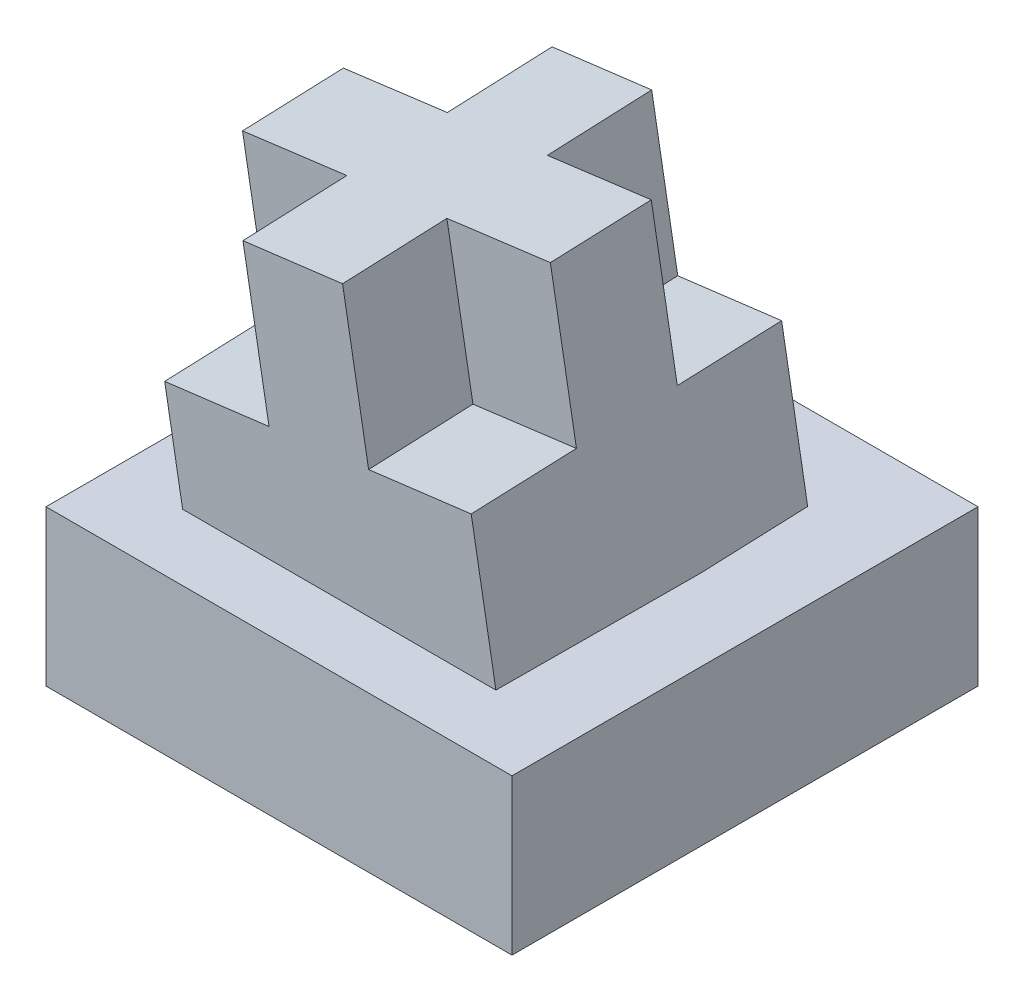
ISO-10303-21;
HEADER;
FILE_DESCRIPTION(('STEP AP214'),'2;1');
FILE_NAME('part.step','',(''),(''),'','','');
FILE_SCHEMA(('AUTOMOTIVE_DESIGN { 1 0 10303 214 1 1 1 1 }'));
ENDSEC;
DATA;
#1=APPLICATION_CONTEXT('core data for automotive mechanical design processes');
#2=APPLICATION_PROTOCOL_DEFINITION('international standard','automotive_design',2000,#1);
#3=PRODUCT_CONTEXT('',#1,'mechanical');
#4=PRODUCT('Part','Part','',(#3));
#5=PRODUCT_RELATED_PRODUCT_CATEGORY('part','',(#4));
#6=PRODUCT_DEFINITION_FORMATION('','',#4);
#7=PRODUCT_DEFINITION_CONTEXT('part definition',#1,'design');
#8=PRODUCT_DEFINITION('design','',#6,#7);
#9=PRODUCT_DEFINITION_SHAPE('','',#8);
#10=(LENGTH_UNIT() NAMED_UNIT(*) SI_UNIT(.MILLI.,.METRE.));
#11=(NAMED_UNIT(*) PLANE_ANGLE_UNIT() SI_UNIT($,.RADIAN.));
#12=(NAMED_UNIT(*) SI_UNIT($,.STERADIAN.) SOLID_ANGLE_UNIT());
#13=UNCERTAINTY_MEASURE_WITH_UNIT(LENGTH_MEASURE(1.E-05),#10,'distance_accuracy_value','');
#14=(GEOMETRIC_REPRESENTATION_CONTEXT(3) GLOBAL_UNCERTAINTY_ASSIGNED_CONTEXT((#13)) GLOBAL_UNIT_ASSIGNED_CONTEXT((#10,
#11,#12)) REPRESENTATION_CONTEXT('',''));
#15=CARTESIAN_POINT('',(0.,0.,0.));
#16=DIRECTION('',(0.,0.,1.));
#17=DIRECTION('',(1.,0.,0.));
#18=AXIS2_PLACEMENT_3D('',#15,#16,#17);
#19=CARTESIAN_POINT('',(15.,10.,15.));
#20=DIRECTION('',(-1.,0.,0.));
#21=DIRECTION('',(0.,0.,1.));
#22=AXIS2_PLACEMENT_3D('',#19,#20,#21);
#23=PLANE('',#22);
#24=DIRECTION('',(0.,0.,-1.));
#25=VECTOR('',#24,1.);
#26=CARTESIAN_POINT('',(15.,0.,15.));
#27=LINE('',#26,#25);
#28=CARTESIAN_POINT('',(15.,0.,15.));
#29=VERTEX_POINT('',#28);
#30=CARTESIAN_POINT('',(15.,0.,-15.));
#31=VERTEX_POINT('',#30);
#32=EDGE_CURVE('E247',#29,#31,#27,.T.);
#33=ORIENTED_EDGE('',*,*,#32,.T.);
#34=DIRECTION('',(0.,-1.,0.));
#35=VECTOR('',#34,1.);
#36=CARTESIAN_POINT('',(15.,10.,-15.));
#37=LINE('',#36,#35);
#38=CARTESIAN_POINT('',(15.,10.,-15.));
#39=VERTEX_POINT('',#38);
#40=EDGE_CURVE('E293',#39,#31,#37,.T.);
#41=ORIENTED_EDGE('',*,*,#40,.F.);
#42=DIRECTION('',(0.,0.,-1.));
#43=VECTOR('',#42,1.);
#44=CARTESIAN_POINT('',(15.,10.,15.));
#45=LINE('',#44,#43);
#46=CARTESIAN_POINT('',(15.,10.,15.));
#47=VERTEX_POINT('',#46);
#48=EDGE_CURVE('E256',#47,#39,#45,.T.);
#49=ORIENTED_EDGE('',*,*,#48,.F.);
#50=DIRECTION('',(0.,-1.,0.));
#51=VECTOR('',#50,1.);
#52=CARTESIAN_POINT('',(15.,10.,15.));
#53=LINE('',#52,#51);
#54=EDGE_CURVE('E270',#47,#29,#53,.T.);
#55=ORIENTED_EDGE('',*,*,#54,.T.);
#56=EDGE_LOOP('',(#33,#41,#49,#55));
#57=FACE_BOUND('',#56,.T.);
#58=ADVANCED_FACE('F43',(#57),#23,.F.);
#59=CARTESIAN_POINT('',(-15.,10.,-15.));
#60=DIRECTION('',(0.,0.,1.));
#61=DIRECTION('',(1.,0.,0.));
#62=AXIS2_PLACEMENT_3D('',#59,#60,#61);
#63=PLANE('',#62);
#64=DIRECTION('',(-1.,0.,0.));
#65=VECTOR('',#64,1.);
#66=CARTESIAN_POINT('',(-15.,0.,-15.));
#67=LINE('',#66,#65);
#68=CARTESIAN_POINT('',(-15.,0.,-15.));
#69=VERTEX_POINT('',#68);
#70=EDGE_CURVE('E274',#31,#69,#67,.T.);
#71=ORIENTED_EDGE('',*,*,#70,.T.);
#72=DIRECTION('',(0.,-1.,0.));
#73=VECTOR('',#72,1.);
#74=CARTESIAN_POINT('',(-15.,10.,-15.));
#75=LINE('',#74,#73);
#76=CARTESIAN_POINT('',(-15.,10.,-15.));
#77=VERTEX_POINT('',#76);
#78=EDGE_CURVE('E289',#77,#69,#75,.T.);
#79=ORIENTED_EDGE('',*,*,#78,.F.);
#80=DIRECTION('',(-1.,0.,0.));
#81=VECTOR('',#80,1.);
#82=CARTESIAN_POINT('',(-15.,10.,-15.));
#83=LINE('',#82,#81);
#84=EDGE_CURVE('E260',#39,#77,#83,.T.);
#85=ORIENTED_EDGE('',*,*,#84,.F.);
#86=ORIENTED_EDGE('',*,*,#40,.T.);
#87=EDGE_LOOP('',(#71,#79,#85,#86));
#88=FACE_BOUND('',#87,.T.);
#89=ADVANCED_FACE('F479',(#88),#63,.F.);
#90=CARTESIAN_POINT('',(-15.,10.,15.));
#91=DIRECTION('',(1.,0.,0.));
#92=DIRECTION('',(0.,0.,-1.));
#93=AXIS2_PLACEMENT_3D('',#90,#91,#92);
#94=PLANE('',#93);
#95=DIRECTION('',(0.,0.,1.));
#96=VECTOR('',#95,1.);
#97=CARTESIAN_POINT('',(-15.,0.,15.));
#98=LINE('',#97,#96);
#99=CARTESIAN_POINT('',(-15.,0.,15.));
#100=VERTEX_POINT('',#99);
#101=EDGE_CURVE('E277',#69,#100,#98,.T.);
#102=ORIENTED_EDGE('',*,*,#101,.T.);
#103=DIRECTION('',(0.,-1.,0.));
#104=VECTOR('',#103,1.);
#105=CARTESIAN_POINT('',(-15.,10.,15.));
#106=LINE('',#105,#104);
#107=CARTESIAN_POINT('',(-15.,10.,15.));
#108=VERTEX_POINT('',#107);
#109=EDGE_CURVE('E285',#108,#100,#106,.T.);
#110=ORIENTED_EDGE('',*,*,#109,.F.);
#111=DIRECTION('',(0.,0.,1.));
#112=VECTOR('',#111,1.);
#113=CARTESIAN_POINT('',(-15.,10.,15.));
#114=LINE('',#113,#112);
#115=EDGE_CURVE('E264',#77,#108,#114,.T.);
#116=ORIENTED_EDGE('',*,*,#115,.F.);
#117=ORIENTED_EDGE('',*,*,#78,.T.);
#118=EDGE_LOOP('',(#102,#110,#116,#117));
#119=FACE_BOUND('',#118,.T.);
#120=ADVANCED_FACE('F484',(#119),#94,.F.);
#121=CARTESIAN_POINT('',(-15.,10.,15.));
#122=DIRECTION('',(0.,0.,-1.));
#123=DIRECTION('',(-1.,0.,0.));
#124=AXIS2_PLACEMENT_3D('',#121,#122,#123);
#125=PLANE('',#124);
#126=DIRECTION('',(1.,0.,0.));
#127=VECTOR('',#126,1.);
#128=CARTESIAN_POINT('',(-15.,0.,15.));
#129=LINE('',#128,#127);
#130=EDGE_CURVE('E261',#100,#29,#129,.T.);
#131=ORIENTED_EDGE('',*,*,#130,.T.);
#132=ORIENTED_EDGE('',*,*,#54,.F.);
#133=DIRECTION('',(1.,0.,0.));
#134=VECTOR('',#133,1.);
#135=CARTESIAN_POINT('',(-15.,10.,15.));
#136=LINE('',#135,#134);
#137=EDGE_CURVE('E267',#108,#47,#136,.T.);
#138=ORIENTED_EDGE('',*,*,#137,.F.);
#139=ORIENTED_EDGE('',*,*,#109,.T.);
#140=EDGE_LOOP('',(#131,#132,#138,#139));
#141=FACE_BOUND('',#140,.T.);
#142=ADVANCED_FACE('F499',(#141),#125,.F.);
#143=CARTESIAN_POINT('',(0.,10.,0.));
#144=DIRECTION('',(0.,-1.,0.));
#145=DIRECTION('',(0.,0.,-1.));
#146=AXIS2_PLACEMENT_3D('',#143,#144,#145);
#147=PLANE('',#146);
#148=DIRECTION('',(-1.,0.,0.));
#149=VECTOR('',#148,1.);
#150=CARTESIAN_POINT('',(0.,10.,10.7411292726449));
#151=LINE('',#150,#149);
#152=CARTESIAN_POINT('',(9.70486879806121,10.,10.7411292726449));
#153=VERTEX_POINT('',#152);
#154=CARTESIAN_POINT('',(-10.463482466703,10.,10.7411292726449));
#155=VERTEX_POINT('',#154);
#156=EDGE_CURVE('E51',#153,#155,#151,.T.);
#157=ORIENTED_EDGE('',*,*,#156,.T.);
#158=DIRECTION('',(0.00508193772155888,0.,-0.999987086871123));
#159=VECTOR('',#158,1.);
#160=CARTESIAN_POINT('',(-10.4086271907026,10.,-0.052896678211698));
#161=LINE('',#160,#159);
#162=CARTESIAN_POINT('',(-10.3617646744846,10.,-9.27416495104109));
#163=VERTEX_POINT('',#162);
#164=EDGE_CURVE('E11',#155,#163,#161,.T.);
#165=ORIENTED_EDGE('',*,*,#164,.T.);
#166=DIRECTION('',(1.,0.,0.));
#167=VECTOR('',#166,1.);
#168=CARTESIAN_POINT('',(0.,10.,-9.27416495104109));
#169=LINE('',#168,#167);
#170=CARTESIAN_POINT('',(7.70309239535227,10.,-9.27416495104109));
#171=VERTEX_POINT('',#170);
#172=EDGE_CURVE('E301',#163,#171,#169,.T.);
#173=ORIENTED_EDGE('',*,*,#172,.T.);
#174=DIRECTION('',(0.287878386169738,0.,0.957666974880259));
#175=VECTOR('',#174,1.);
#176=CARTESIAN_POINT('',(9.62151617339583,10.,-2.89226486989336));
#177=LINE('',#176,#175);
#178=CARTESIAN_POINT('',(9.77161616497961,10.,-2.39293664042066));
#179=VERTEX_POINT('',#178);
#180=EDGE_CURVE('E297',#171,#179,#177,.T.);
#181=ORIENTED_EDGE('',*,*,#180,.T.);
#182=DIRECTION('',(-0.00508193772155887,0.,0.999987086871123));
#183=VECTOR('',#182,1.);
#184=CARTESIAN_POINT('',(9.7592032043864,10.,0.0495963033401863));
#185=LINE('',#184,#183);
#186=EDGE_CURVE('E305',#179,#153,#185,.T.);
#187=ORIENTED_EDGE('',*,*,#186,.T.);
#188=EDGE_LOOP('',(#157,#165,#173,#181,#187));
#189=FACE_BOUND('',#188,.T.);
#190=ORIENTED_EDGE('',*,*,#48,.T.);
#191=ORIENTED_EDGE('',*,*,#84,.T.);
#192=ORIENTED_EDGE('',*,*,#115,.T.);
#193=ORIENTED_EDGE('',*,*,#137,.T.);
#194=EDGE_LOOP('',(#190,#191,#192,#193));
#195=FACE_BOUND('',#194,.T.);
#196=ADVANCED_FACE('F312',(#189,#195),#147,.F.);
#197=CARTESIAN_POINT('',(0.,0.,0.));
#198=DIRECTION('',(0.,-1.,0.));
#199=DIRECTION('',(0.,0.,-1.));
#200=AXIS2_PLACEMENT_3D('',#197,#198,#199);
#201=PLANE('',#200);
#202=ORIENTED_EDGE('',*,*,#32,.F.);
#203=ORIENTED_EDGE('',*,*,#130,.F.);
#204=ORIENTED_EDGE('',*,*,#101,.F.);
#205=ORIENTED_EDGE('',*,*,#70,.F.);
#206=EDGE_LOOP('',(#202,#203,#204,#205));
#207=FACE_BOUND('',#206,.T.);
#208=ADVANCED_FACE('F492',(#207),#201,.T.);
#209=CARTESIAN_POINT('',(7.19286288242222,29.3049408690089,11.4962479391661));
#210=DIRECTION('',(0.991652700681669,0.128839139396997,0.00503958234305619));
#211=DIRECTION('',(-0.128840775517109,0.991665293616828,0.));
#212=AXIS2_PLACEMENT_3D('',#209,#210,#211);
#213=PLANE('',#212);
#214=DIRECTION('',(-0.128937664127869,0.990894952229234,0.0387591591223742));
#215=VECTOR('',#214,1.);
#216=CARTESIAN_POINT('',(8.48223952370092,19.6609485103213,4.33490991180389));
#217=LINE('',#216,#215);
#218=CARTESIAN_POINT('',(8.48223952370092,19.6609485103213,4.33490991180389));
#219=VERTEX_POINT('',#218);
#220=CARTESIAN_POINT('',(7.19286288242222,29.5698980326136,4.72250150302721));
#221=VERTEX_POINT('',#220);
#222=EDGE_CURVE('E344',#219,#221,#217,.T.);
#223=ORIENTED_EDGE('',*,*,#222,.F.);
#224=DIRECTION('',(0.,0.0390854167953465,-0.999235873152047));
#225=VECTOR('',#224,1.);
#226=CARTESIAN_POINT('',(8.48223952370092,19.6609485103213,4.33490991180389));
#227=LINE('',#226,#225);
#228=CARTESIAN_POINT('',(8.48223952370092,19.3959913467166,11.1086563479424));
#229=VERTEX_POINT('',#228);
#230=EDGE_CURVE('E343',#229,#219,#227,.T.);
#231=ORIENTED_EDGE('',*,*,#230,.F.);
#232=DIRECTION('',(0.128937664127869,-0.990894952229234,-0.0387591591223743));
#233=VECTOR('',#232,1.);
#234=CARTESIAN_POINT('',(7.19286288242222,29.3049408690089,11.4962479391661));
#235=LINE('',#234,#233);
#236=EDGE_CURVE('E240',#229,#153,#235,.T.);
#237=ORIENTED_EDGE('',*,*,#236,.T.);
#238=ORIENTED_EDGE('',*,*,#186,.F.);
#239=DIRECTION('',(0.,-0.0390854167953467,0.999235873152047));
#240=VECTOR('',#239,1.);
#241=CARTESIAN_POINT('',(9.77161616497961,9.48704182442421,10.7210647567186));
#242=LINE('',#241,#240);
#243=CARTESIAN_POINT('',(9.77161616497961,10.2687501603311,-9.26365270632231));
#244=VERTEX_POINT('',#243);
#245=EDGE_CURVE('E228',#244,#179,#242,.T.);
#246=ORIENTED_EDGE('',*,*,#245,.F.);
#247=DIRECTION('',(0.128937664127869,-0.990894952229234,-0.0387591591223743));
#248=VECTOR('',#247,1.);
#249=CARTESIAN_POINT('',(7.19286288242222,30.0866492049158,-8.48846952387482));
#250=LINE('',#249,#248);
#251=CARTESIAN_POINT('',(8.48223952370092,20.1776996826235,-8.87606111509856));
#252=VERTEX_POINT('',#251);
#253=EDGE_CURVE('E244',#252,#244,#250,.T.);
#254=ORIENTED_EDGE('',*,*,#253,.F.);
#255=DIRECTION('',(0.,0.0390854167953467,-0.999235873152047));
#256=VECTOR('',#255,1.);
#257=CARTESIAN_POINT('',(8.48223952370092,20.1776996826235,-8.87606111509856));
#258=LINE('',#257,#256);
#259=CARTESIAN_POINT('',(8.48223952370092,19.9150037194911,-2.16012326368442));
#260=VERTEX_POINT('',#259);
#261=EDGE_CURVE('E209',#260,#252,#258,.T.);
#262=ORIENTED_EDGE('',*,*,#261,.F.);
#263=DIRECTION('',(-0.128937664127869,0.990894952229234,0.0387591591223742));
#264=VECTOR('',#263,1.);
#265=CARTESIAN_POINT('',(8.48223952370092,19.9150037194911,-2.16012326368442));
#266=LINE('',#265,#264);
#267=CARTESIAN_POINT('',(7.19286288242222,29.8239532417834,-1.77253167246067));
#268=VERTEX_POINT('',#267);
#269=EDGE_CURVE('E191',#260,#268,#266,.T.);
#270=ORIENTED_EDGE('',*,*,#269,.T.);
#271=DIRECTION('',(0.,-0.0390854167953467,0.999235873152047));
#272=VECTOR('',#271,1.);
#273=CARTESIAN_POINT('',(7.19286288242222,29.3049408690089,11.4962479391661));
#274=LINE('',#273,#272);
#275=EDGE_CURVE('E207',#268,#221,#274,.T.);
#276=ORIENTED_EDGE('',*,*,#275,.T.);
#277=EDGE_LOOP('',(#223,#231,#237,#238,#246,#254,#262,#270,#276));
#278=FACE_BOUND('',#277,.T.);
#279=ADVANCED_FACE('F206',(#278),#213,.T.);
#280=CARTESIAN_POINT('',(-12.6401911312112,27.5098664169759,-8.58926117073594));
#281=DIRECTION('',(0.,0.0390854167953467,-0.999235873152047));
#282=DIRECTION('',(0.,0.999235873152047,0.0390854167953467));
#283=AXIS2_PLACEMENT_3D('',#280,#281,#282);
#284=PLANE('',#283);
#285=DIRECTION('',(-0.128937664127869,0.990894952229234,0.0387591591223742));
#286=VECTOR('',#285,1.);
#287=CARTESIAN_POINT('',(-4.68599240383939,18.4668349133771,-8.94298211381685));
#288=LINE('',#287,#286);
#289=CARTESIAN_POINT('',(-4.68599240383939,18.4668349133771,-8.94298211381685));
#290=VERTEX_POINT('',#289);
#291=CARTESIAN_POINT('',(-5.97536904511808,28.3757844356694,-8.55539052259311));
#292=VERTEX_POINT('',#291);
#293=EDGE_CURVE('E365',#290,#292,#288,.T.);
#294=ORIENTED_EDGE('',*,*,#293,.T.);
#295=DIRECTION('',(0.99165270068167,0.128839139396997,0.00503958234305615));
#296=VECTOR('',#295,1.);
#297=CARTESIAN_POINT('',(-12.6401911312112,27.5098664169759,-8.58926117073594));
#298=LINE('',#297,#296);
#299=CARTESIAN_POINT('',(0.470432940707133,29.2132465632936,-8.52263293533269));
#300=VERTEX_POINT('',#299);
#301=EDGE_CURVE('E236',#292,#300,#298,.T.);
#302=ORIENTED_EDGE('',*,*,#301,.T.);
#303=DIRECTION('',(-0.128937664127869,0.990894952229234,0.0387591591223742));
#304=VECTOR('',#303,1.);
#305=CARTESIAN_POINT('',(1.75980958198582,19.3042970410013,-8.91022452655644));
#306=LINE('',#305,#304);
#307=CARTESIAN_POINT('',(1.75980958198582,19.3042970410013,-8.91022452655644));
#308=VERTEX_POINT('',#307);
#309=EDGE_CURVE('E441',#308,#300,#306,.T.);
#310=ORIENTED_EDGE('',*,*,#309,.F.);
#311=DIRECTION('',(-0.991652700681669,-0.128839139396997,-0.00503958234305611));
#312=VECTOR('',#311,1.);
#313=CARTESIAN_POINT('',(1.75980958198582,19.3042970410013,-8.91022452655644));
#314=LINE('',#313,#312);
#315=EDGE_CURVE('E200',#252,#308,#314,.T.);
#316=ORIENTED_EDGE('',*,*,#315,.F.);
#317=ORIENTED_EDGE('',*,*,#253,.T.);
#318=DIRECTION('',(0.99165270068167,0.128839139396997,0.00503958234305615));
#319=VECTOR('',#318,1.);
#320=CARTESIAN_POINT('',(-10.0614378486538,7.69196737239121,-9.36444435318343));
#321=LINE('',#320,#319);
#322=EDGE_CURVE('E220',#171,#244,#321,.T.);
#323=ORIENTED_EDGE('',*,*,#322,.F.);
#324=ORIENTED_EDGE('',*,*,#172,.F.);
#325=DIRECTION('',(0.128937664127869,-0.990894952229234,-0.0387591591223743));
#326=VECTOR('',#325,1.);
#327=CARTESIAN_POINT('',(-12.6401911312112,27.5098664169759,-8.58926117073594));
#328=LINE('',#327,#326);
#329=CARTESIAN_POINT('',(-11.3508144899325,17.6009168946836,-8.97685276195969));
#330=VERTEX_POINT('',#329);
#331=EDGE_CURVE('E248',#330,#163,#328,.T.);
#332=ORIENTED_EDGE('',*,*,#331,.F.);
#333=DIRECTION('',(-0.99165270068167,-0.128839139396997,-0.00503958234305645));
#334=VECTOR('',#333,1.);
#335=CARTESIAN_POINT('',(-11.3508144899325,17.6009168946836,-8.97685276195969));
#336=LINE('',#335,#334);
#337=EDGE_CURVE('E361',#290,#330,#336,.T.);
#338=ORIENTED_EDGE('',*,*,#337,.F.);
#339=EDGE_LOOP('',(#294,#302,#310,#316,#317,#323,#324,#332,#338));
#340=FACE_BOUND('',#339,.T.);
#341=ADVANCED_FACE('F337',(#340),#284,.T.);
#342=CARTESIAN_POINT('',(-12.6401911312112,26.728158081069,11.395456292305));
#343=DIRECTION('',(-0.991652700681669,-0.128839139396997,-0.0050395823430562));
#344=DIRECTION('',(0.128840775517109,-0.991665293616828,0.));
#345=AXIS2_PLACEMENT_3D('',#342,#343,#344);
#346=PLANE('',#345);
#347=DIRECTION('',(-0.128937664127869,0.990894952229234,0.0387591591223742));
#348=VECTOR('',#347,1.);
#349=CARTESIAN_POINT('',(-11.3508144899325,17.3348640793193,-2.17509550663703));
#350=LINE('',#349,#348);
#351=CARTESIAN_POINT('',(-11.3508144899325,17.3348640793193,-2.17509550663703));
#352=VERTEX_POINT('',#351);
#353=CARTESIAN_POINT('',(-12.6401911312112,27.2438136016116,-1.78750391541329));
#354=VERTEX_POINT('',#353);
#355=EDGE_CURVE('E66',#352,#354,#350,.T.);
#356=ORIENTED_EDGE('',*,*,#355,.F.);
#357=DIRECTION('',(0.,-0.0390854167953464,0.999235873152047));
#358=VECTOR('',#357,1.);
#359=CARTESIAN_POINT('',(-11.3508144899325,17.3348640793193,-2.17509550663703));
#360=LINE('',#359,#358);
#361=EDGE_CURVE('E332',#330,#352,#360,.T.);
#362=ORIENTED_EDGE('',*,*,#361,.F.);
#363=ORIENTED_EDGE('',*,*,#331,.T.);
#364=ORIENTED_EDGE('',*,*,#164,.F.);
#365=DIRECTION('',(0.128937664127869,-0.990894952229234,-0.0387591591223743));
#366=VECTOR('',#365,1.);
#367=CARTESIAN_POINT('',(-12.6401911312112,26.728158081069,11.395456292305));
#368=LINE('',#367,#366);
#369=CARTESIAN_POINT('',(-11.3508144899325,16.8192085587766,11.0078647010813));
#370=VERTEX_POINT('',#369);
#371=EDGE_CURVE('E251',#370,#155,#368,.T.);
#372=ORIENTED_EDGE('',*,*,#371,.F.);
#373=DIRECTION('',(0.,-0.0390854167953467,0.999235873152047));
#374=VECTOR('',#373,1.);
#375=CARTESIAN_POINT('',(-11.3508144899325,17.0808065276956,4.31999755471776));
#376=LINE('',#375,#374);
#377=CARTESIAN_POINT('',(-11.3508144899325,17.0808065276956,4.31999755471776));
#378=VERTEX_POINT('',#377);
#379=EDGE_CURVE('E398',#378,#370,#376,.T.);
#380=ORIENTED_EDGE('',*,*,#379,.F.);
#381=DIRECTION('',(-0.128937664127869,0.990894952229234,0.0387591591223742));
#382=VECTOR('',#381,1.);
#383=CARTESIAN_POINT('',(-11.3508144899325,17.0808065276956,4.31999755471776));
#384=LINE('',#383,#382);
#385=CARTESIAN_POINT('',(-12.6401911312112,26.9897560499879,4.70758914594151));
#386=VERTEX_POINT('',#385);
#387=EDGE_CURVE('E242',#378,#386,#384,.T.);
#388=ORIENTED_EDGE('',*,*,#387,.T.);
#389=DIRECTION('',(0.,0.0390854167953467,-0.999235873152047));
#390=VECTOR('',#389,1.);
#391=CARTESIAN_POINT('',(-12.6401911312112,26.728158081069,11.395456292305));
#392=LINE('',#391,#390);
#393=EDGE_CURVE('E225',#386,#354,#392,.T.);
#394=ORIENTED_EDGE('',*,*,#393,.T.);
#395=EDGE_LOOP('',(#356,#362,#363,#364,#372,#380,#388,#394));
#396=FACE_BOUND('',#395,.T.);
#397=ADVANCED_FACE('F327',(#396),#346,.T.);
#398=CARTESIAN_POINT('',(-12.6401911312112,26.728158081069,11.395456292305));
#399=DIRECTION('',(0.,-0.0390854167953467,0.999235873152047));
#400=DIRECTION('',(0.,-0.999235873152047,-0.0390854167953467));
#401=AXIS2_PLACEMENT_3D('',#398,#399,#400);
#402=PLANE('',#401);
#403=DIRECTION('',(-0.128937664127869,0.990894952229234,0.0387591591223742));
#404=VECTOR('',#403,1.);
#405=CARTESIAN_POINT('',(1.84497770489189,18.5336540585712,11.0749257611701));
#406=LINE('',#405,#404);
#407=CARTESIAN_POINT('',(1.84497770489189,18.5336540585712,11.0749257611701));
#408=VERTEX_POINT('',#407);
#409=CARTESIAN_POINT('',(0.555601063613198,28.4426035808635,11.4625173523938));
#410=VERTEX_POINT('',#409);
#411=EDGE_CURVE('E374',#408,#410,#406,.T.);
#412=ORIENTED_EDGE('',*,*,#411,.T.);
#413=DIRECTION('',(-0.99165270068167,-0.128839139396997,-0.00503958234305624));
#414=VECTOR('',#413,1.);
#415=CARTESIAN_POINT('',(-12.6401911312112,26.728158081069,11.395456292305));
#416=LINE('',#415,#414);
#417=CARTESIAN_POINT('',(-5.89020092221201,27.6051414532393,11.4297597651334));
#418=VERTEX_POINT('',#417);
#419=EDGE_CURVE('E219',#410,#418,#416,.T.);
#420=ORIENTED_EDGE('',*,*,#419,.T.);
#421=DIRECTION('',(-0.128937664127869,0.990894952229234,0.0387591591223742));
#422=VECTOR('',#421,1.);
#423=CARTESIAN_POINT('',(-4.60082428093332,17.6961919309469,11.0421681739097));
#424=LINE('',#423,#422);
#425=CARTESIAN_POINT('',(-4.60082428093332,17.6961919309469,11.0421681739097));
#426=VERTEX_POINT('',#425);
#427=EDGE_CURVE('E58',#426,#418,#424,.T.);
#428=ORIENTED_EDGE('',*,*,#427,.F.);
#429=DIRECTION('',(0.991652700681669,0.128839139396997,0.00503958234305577));
#430=VECTOR('',#429,1.);
#431=CARTESIAN_POINT('',(-11.3508144899325,16.8192085587766,11.0078647010813));
#432=LINE('',#431,#430);
#433=EDGE_CURVE('E324',#370,#426,#432,.T.);
#434=ORIENTED_EDGE('',*,*,#433,.F.);
#435=ORIENTED_EDGE('',*,*,#371,.T.);
#436=ORIENTED_EDGE('',*,*,#156,.F.);
#437=ORIENTED_EDGE('',*,*,#236,.F.);
#438=DIRECTION('',(0.99165270068167,0.128839139396997,0.00503958234305602));
#439=VECTOR('',#438,1.);
#440=CARTESIAN_POINT('',(8.48223952370092,19.3959913467166,11.1086563479424));
#441=LINE('',#440,#439);
#442=EDGE_CURVE('E348',#408,#229,#441,.T.);
#443=ORIENTED_EDGE('',*,*,#442,.F.);
#444=EDGE_LOOP('',(#412,#420,#428,#434,#435,#436,#437,#443));
#445=FACE_BOUND('',#444,.T.);
#446=ADVANCED_FACE('F319',(#445),#402,.T.);
#447=CARTESIAN_POINT('',(-1.10322571851606,8.4783666823909,0.331633905896216));
#448=DIRECTION('',(0.128937664127869,-0.990894952229234,-0.0387591591223742));
#449=DIRECTION('',(0.991640088960064,0.129034623133779,0.));
#450=AXIS2_PLACEMENT_3D('',#447,#448,#449);
#451=PLANE('',#450);
#452=ORIENTED_EDGE('',*,*,#180,.F.);
#453=ORIENTED_EDGE('',*,*,#322,.T.);
#454=ORIENTED_EDGE('',*,*,#245,.T.);
#455=EDGE_LOOP('',(#452,#453,#454));
#456=FACE_BOUND('',#455,.T.);
#457=ADVANCED_FACE('F339',(#456),#451,.T.);
#458=CARTESIAN_POINT('',(-3.68197900107345,28.2962657269756,1.1068170883437));
#459=DIRECTION('',(0.128937664127869,-0.990894952229234,-0.0387591591223742));
#460=DIRECTION('',(0.991640088960064,0.129034623133779,0.));
#461=AXIS2_PLACEMENT_3D('',#458,#459,#460);
#462=PLANE('',#461);
#463=ORIENTED_EDGE('',*,*,#419,.F.);
#464=DIRECTION('',(0.00425836688207199,-0.0385317938485154,0.999248301061509));
#465=VECTOR('',#464,1.);
#466=CARTESIAN_POINT('',(0.555601063613198,28.4426035808635,11.4625173523938));
#467=LINE('',#466,#465);
#468=CARTESIAN_POINT('',(0.526856566922572,28.7026978966975,4.71746924395091));
#469=VERTEX_POINT('',#468);
#470=EDGE_CURVE('E353',#469,#410,#467,.T.);
#471=ORIENTED_EDGE('',*,*,#470,.F.);
#472=DIRECTION('',(-0.991643557474532,-0.129005792542196,-0.000748605245298765));
#473=VECTOR('',#472,1.);
#474=CARTESIAN_POINT('',(0.526856566922572,28.7026978966975,4.71746924395091));
#475=LINE('',#474,#473);
#476=EDGE_CURVE('E217',#221,#469,#475,.T.);
#477=ORIENTED_EDGE('',*,*,#476,.F.);
#478=ORIENTED_EDGE('',*,*,#275,.F.);
#479=DIRECTION('',(0.991643557474533,0.129005792542196,0.000748605245298882));
#480=VECTOR('',#479,1.);
#481=CARTESIAN_POINT('',(7.19286288242222,29.8239532417834,-1.77253167246067));
#482=LINE('',#481,#480);
#483=CARTESIAN_POINT('',(0.499177437397754,28.9531522474597,-1.77758482688976));
#484=VERTEX_POINT('',#483);
#485=EDGE_CURVE('E187',#484,#268,#482,.T.);
#486=ORIENTED_EDGE('',*,*,#485,.F.);
#487=DIRECTION('',(0.00425836688207199,-0.0385317938485149,0.999248301061509));
#488=VECTOR('',#487,1.);
#489=CARTESIAN_POINT('',(0.499177437397754,28.9531522474597,-1.77758482688976));
#490=LINE('',#489,#488);
#491=EDGE_CURVE('E199',#300,#484,#490,.T.);
#492=ORIENTED_EDGE('',*,*,#491,.F.);
#493=ORIENTED_EDGE('',*,*,#301,.F.);
#494=DIRECTION('',(-0.00425836688207198,0.0385317938485153,-0.999248301061509));
#495=VECTOR('',#494,1.);
#496=CARTESIAN_POINT('',(-5.97536904511808,28.3757844356694,-8.55539052259311));
#497=LINE('',#496,#495);
#498=CARTESIAN_POINT('',(-5.94650568618671,28.1146145959354,-1.7824507609842));
#499=VERTEX_POINT('',#498);
#500=EDGE_CURVE('E368',#499,#292,#497,.T.);
#501=ORIENTED_EDGE('',*,*,#500,.F.);
#502=DIRECTION('',(0.991643557474532,0.129005792542196,0.000748605245298882));
#503=VECTOR('',#502,1.);
#504=CARTESIAN_POINT('',(-5.94650568618671,28.1146145959354,-1.7824507609842));
#505=LINE('',#504,#503);
#506=EDGE_CURVE('E371',#354,#499,#505,.T.);
#507=ORIENTED_EDGE('',*,*,#506,.F.);
#508=ORIENTED_EDGE('',*,*,#393,.F.);
#509=DIRECTION('',(-0.991643557474532,-0.129005792542196,-0.000748605245298816));
#510=VECTOR('',#509,1.);
#511=CARTESIAN_POINT('',(-5.91882630145324,27.86415793592,4.71266319591561));
#512=LINE('',#511,#510);
#513=CARTESIAN_POINT('',(-5.91882630145324,27.86415793592,4.71266319591561));
#514=VERTEX_POINT('',#513);
#515=EDGE_CURVE('E390',#514,#386,#512,.T.);
#516=ORIENTED_EDGE('',*,*,#515,.F.);
#517=DIRECTION('',(-0.00425836688207213,0.0385317938485149,-0.99924830106151));
#518=VECTOR('',#517,1.);
#519=CARTESIAN_POINT('',(-5.89020092221201,27.6051414532393,11.4297597651334));
#520=LINE('',#519,#518);
#521=EDGE_CURVE('E401',#418,#514,#520,.T.);
#522=ORIENTED_EDGE('',*,*,#521,.F.);
#523=EDGE_LOOP('',(#463,#471,#477,#478,#486,#492,#493,#501,#507,#508,#516,#522));
#524=FACE_BOUND('',#523,.T.);
#525=ADVANCED_FACE('F214',(#524),#462,.F.);
#526=CARTESIAN_POINT('',(-4.62944966017455,17.9552084136277,4.32507160469187));
#527=DIRECTION('',(-0.00425836688207206,0.0385317938485154,-0.99924830106151));
#528=DIRECTION('',(0.,0.999257361213444,0.0385321432150404));
#529=AXIS2_PLACEMENT_3D('',#526,#527,#528);
#530=PLANE('',#529);
#531=ORIENTED_EDGE('',*,*,#515,.T.);
#532=ORIENTED_EDGE('',*,*,#387,.F.);
#533=DIRECTION('',(-0.991643557474532,-0.129005792542196,-0.000748605245298816));
#534=VECTOR('',#533,1.);
#535=CARTESIAN_POINT('',(-4.62944966017455,17.9552084136277,4.32507160469187));
#536=LINE('',#535,#534);
#537=CARTESIAN_POINT('',(-4.62944966017455,17.9552084136277,4.32507160469187));
#538=VERTEX_POINT('',#537);
#539=EDGE_CURVE('E394',#538,#378,#536,.T.);
#540=ORIENTED_EDGE('',*,*,#539,.F.);
#541=DIRECTION('',(-0.128937664127869,0.990894952229234,0.0387591591223742));
#542=VECTOR('',#541,1.);
#543=CARTESIAN_POINT('',(-4.62944966017455,17.9552084136277,4.32507160469187));
#544=LINE('',#543,#542);
#545=EDGE_CURVE('E408',#538,#514,#544,.T.);
#546=ORIENTED_EDGE('',*,*,#545,.T.);
#547=EDGE_LOOP('',(#531,#532,#540,#546));
#548=FACE_BOUND('',#547,.T.);
#549=ADVANCED_FACE('F461',(#548),#530,.F.);
#550=CARTESIAN_POINT('',(-4.60082428093332,17.6961919309469,11.0421681739097));
#551=DIRECTION('',(0.991643557474533,0.129005792542197,0.000748605245298704));
#552=DIRECTION('',(-0.129005828690268,0.99164383533804,0.));
#553=AXIS2_PLACEMENT_3D('',#550,#551,#552);
#554=PLANE('',#553);
#555=ORIENTED_EDGE('',*,*,#521,.T.);
#556=ORIENTED_EDGE('',*,*,#545,.F.);
#557=DIRECTION('',(-0.00425836688207213,0.0385317938485149,-0.99924830106151));
#558=VECTOR('',#557,1.);
#559=CARTESIAN_POINT('',(-4.60082428093332,17.6961919309469,11.0421681739097));
#560=LINE('',#559,#558);
#561=EDGE_CURVE('E389',#426,#538,#560,.T.);
#562=ORIENTED_EDGE('',*,*,#561,.F.);
#563=ORIENTED_EDGE('',*,*,#427,.T.);
#564=EDGE_LOOP('',(#555,#556,#562,#563));
#565=FACE_BOUND('',#564,.T.);
#566=ADVANCED_FACE('F464',(#565),#554,.F.);
#567=CARTESIAN_POINT('',(-2.39260235979476,18.3873162046833,0.719225497119961));
#568=DIRECTION('',(0.12893766412787,-0.990894952229234,-0.0387591591223743));
#569=DIRECTION('',(0.991640088960064,0.129034623133779,0.));
#570=AXIS2_PLACEMENT_3D('',#567,#568,#569);
#571=PLANE('',#570);
#572=ORIENTED_EDGE('',*,*,#433,.T.);
#573=ORIENTED_EDGE('',*,*,#561,.T.);
#574=ORIENTED_EDGE('',*,*,#539,.T.);
#575=ORIENTED_EDGE('',*,*,#379,.T.);
#576=EDGE_LOOP('',(#572,#573,#574,#575));
#577=FACE_BOUND('',#576,.T.);
#578=ADVANCED_FACE('F463',(#577),#571,.F.);
#579=CARTESIAN_POINT('',(8.48223952370092,19.9150037194911,-2.16012326368442));
#580=DIRECTION('',(0.004258366882072,-0.0385317938485154,0.99924830106151));
#581=DIRECTION('',(0.,-0.999257361213444,-0.0385321432150404));
#582=AXIS2_PLACEMENT_3D('',#579,#580,#581);
#583=PLANE('',#582);
#584=ORIENTED_EDGE('',*,*,#485,.T.);
#585=ORIENTED_EDGE('',*,*,#269,.F.);
#586=DIRECTION('',(0.991643557474533,0.129005792542196,0.000748605245298882));
#587=VECTOR('',#586,1.);
#588=CARTESIAN_POINT('',(8.48223952370092,19.9150037194911,-2.16012326368442));
#589=LINE('',#588,#587);
#590=CARTESIAN_POINT('',(1.78855407867645,19.0442027251673,-2.1651764181135));
#591=VERTEX_POINT('',#590);
#592=EDGE_CURVE('E436',#591,#260,#589,.T.);
#593=ORIENTED_EDGE('',*,*,#592,.F.);
#594=DIRECTION('',(-0.128937664127869,0.990894952229234,0.0387591591223742));
#595=VECTOR('',#594,1.);
#596=CARTESIAN_POINT('',(1.78855407867645,19.0442027251673,-2.1651764181135));
#597=LINE('',#596,#595);
#598=EDGE_CURVE('E193',#591,#484,#597,.T.);
#599=ORIENTED_EDGE('',*,*,#598,.T.);
#600=EDGE_LOOP('',(#584,#585,#593,#599));
#601=FACE_BOUND('',#600,.T.);
#602=ADVANCED_FACE('F189',(#601),#583,.F.);
#603=CARTESIAN_POINT('',(1.78855407867645,19.0442027251673,-2.1651764181135));
#604=DIRECTION('',(-0.991643557474533,-0.129005792542197,-0.000748605245298841));
#605=DIRECTION('',(0.129005828690268,-0.99164383533804,0.));
#606=AXIS2_PLACEMENT_3D('',#603,#604,#605);
#607=PLANE('',#606);
#608=ORIENTED_EDGE('',*,*,#491,.T.);
#609=ORIENTED_EDGE('',*,*,#598,.F.);
#610=DIRECTION('',(0.00425836688207199,-0.0385317938485149,0.999248301061509));
#611=VECTOR('',#610,1.);
#612=CARTESIAN_POINT('',(1.78855407867645,19.0442027251673,-2.1651764181135));
#613=LINE('',#612,#611);
#614=EDGE_CURVE('E432',#308,#591,#613,.T.);
#615=ORIENTED_EDGE('',*,*,#614,.F.);
#616=ORIENTED_EDGE('',*,*,#309,.T.);
#617=EDGE_LOOP('',(#608,#609,#615,#616));
#618=FACE_BOUND('',#617,.T.);
#619=ADVANCED_FACE('F449',(#618),#607,.F.);
#620=CARTESIAN_POINT('',(-2.39260235979477,18.3873162046833,0.719225497119961));
#621=DIRECTION('',(0.12893766412787,-0.990894952229234,-0.0387591591223743));
#622=DIRECTION('',(0.991640088960064,0.129034623133779,0.));
#623=AXIS2_PLACEMENT_3D('',#620,#621,#622);
#624=PLANE('',#623);
#625=ORIENTED_EDGE('',*,*,#315,.T.);
#626=ORIENTED_EDGE('',*,*,#614,.T.);
#627=ORIENTED_EDGE('',*,*,#592,.T.);
#628=ORIENTED_EDGE('',*,*,#261,.T.);
#629=EDGE_LOOP('',(#625,#626,#627,#628));
#630=FACE_BOUND('',#629,.T.);
#631=ADVANCED_FACE('F534',(#630),#624,.F.);
#632=CARTESIAN_POINT('',(-4.68599240383939,18.4668349133771,-8.94298211381685));
#633=DIRECTION('',(0.991643557474533,0.129005792542197,0.000748605245298899));
#634=DIRECTION('',(-0.129005828690268,0.99164383533804,0.));
#635=AXIS2_PLACEMENT_3D('',#632,#633,#634);
#636=PLANE('',#635);
#637=ORIENTED_EDGE('',*,*,#500,.T.);
#638=ORIENTED_EDGE('',*,*,#293,.F.);
#639=DIRECTION('',(-0.00425836688207198,0.0385317938485153,-0.999248301061509));
#640=VECTOR('',#639,1.);
#641=CARTESIAN_POINT('',(-4.68599240383939,18.4668349133771,-8.94298211381685));
#642=LINE('',#641,#640);
#643=CARTESIAN_POINT('',(-4.65712904490801,18.2056650736431,-2.17004235220794));
#644=VERTEX_POINT('',#643);
#645=EDGE_CURVE('E377',#644,#290,#642,.T.);
#646=ORIENTED_EDGE('',*,*,#645,.F.);
#647=DIRECTION('',(-0.128937664127869,0.990894952229234,0.0387591591223742));
#648=VECTOR('',#647,1.);
#649=CARTESIAN_POINT('',(-4.65712904490801,18.2056650736431,-2.17004235220794));
#650=LINE('',#649,#648);
#651=EDGE_CURVE('E362',#644,#499,#650,.T.);
#652=ORIENTED_EDGE('',*,*,#651,.T.);
#653=EDGE_LOOP('',(#637,#638,#646,#652));
#654=FACE_BOUND('',#653,.T.);
#655=ADVANCED_FACE('F455',(#654),#636,.F.);
#656=CARTESIAN_POINT('',(-4.65712904490801,18.2056650736431,-2.17004235220794));
#657=DIRECTION('',(0.004258366882072,-0.0385317938485154,0.99924830106151));
#658=DIRECTION('',(0.,-0.999257361213444,-0.0385321432150404));
#659=AXIS2_PLACEMENT_3D('',#656,#657,#658);
#660=PLANE('',#659);
#661=ORIENTED_EDGE('',*,*,#506,.T.);
#662=ORIENTED_EDGE('',*,*,#651,.F.);
#663=DIRECTION('',(0.991643557474532,0.129005792542196,0.000748605245298882));
#664=VECTOR('',#663,1.);
#665=CARTESIAN_POINT('',(-4.65712904490801,18.2056650736431,-2.17004235220794));
#666=LINE('',#665,#664);
#667=EDGE_CURVE('E381',#352,#644,#666,.T.);
#668=ORIENTED_EDGE('',*,*,#667,.F.);
#669=ORIENTED_EDGE('',*,*,#355,.T.);
#670=EDGE_LOOP('',(#661,#662,#668,#669));
#671=FACE_BOUND('',#670,.T.);
#672=ADVANCED_FACE('F458',(#671),#660,.F.);
#673=CARTESIAN_POINT('',(-2.39260235979476,18.3873162046833,0.719225497119953));
#674=DIRECTION('',(0.128937664127869,-0.990894952229234,-0.038759159122374));
#675=DIRECTION('',(0.991640088960064,0.129034623133779,0.));
#676=AXIS2_PLACEMENT_3D('',#673,#674,#675);
#677=PLANE('',#676);
#678=ORIENTED_EDGE('',*,*,#361,.T.);
#679=ORIENTED_EDGE('',*,*,#667,.T.);
#680=ORIENTED_EDGE('',*,*,#645,.T.);
#681=ORIENTED_EDGE('',*,*,#337,.T.);
#682=EDGE_LOOP('',(#678,#679,#680,#681));
#683=FACE_BOUND('',#682,.T.);
#684=ADVANCED_FACE('F457',(#683),#677,.F.);
#685=CARTESIAN_POINT('',(1.84497770489189,18.5336540585712,11.0749257611701));
#686=DIRECTION('',(-0.991643557474533,-0.129005792542197,-0.000748605245298907));
#687=DIRECTION('',(0.129005828690268,-0.99164383533804,0.));
#688=AXIS2_PLACEMENT_3D('',#685,#686,#687);
#689=PLANE('',#688);
#690=ORIENTED_EDGE('',*,*,#470,.T.);
#691=ORIENTED_EDGE('',*,*,#411,.F.);
#692=DIRECTION('',(0.00425836688207199,-0.0385317938485154,0.999248301061509));
#693=VECTOR('',#692,1.);
#694=CARTESIAN_POINT('',(1.84497770489189,18.5336540585712,11.0749257611701));
#695=LINE('',#694,#693);
#696=CARTESIAN_POINT('',(1.81623320820127,18.7937483744051,4.32987765272716));
#697=VERTEX_POINT('',#696);
#698=EDGE_CURVE('E355',#697,#408,#695,.T.);
#699=ORIENTED_EDGE('',*,*,#698,.F.);
#700=DIRECTION('',(-0.128937664127869,0.990894952229234,0.0387591591223742));
#701=VECTOR('',#700,1.);
#702=CARTESIAN_POINT('',(1.81623320820127,18.7937483744051,4.32987765272716));
#703=LINE('',#702,#701);
#704=EDGE_CURVE('E424',#697,#469,#703,.T.);
#705=ORIENTED_EDGE('',*,*,#704,.T.);
#706=EDGE_LOOP('',(#690,#691,#699,#705));
#707=FACE_BOUND('',#706,.T.);
#708=ADVANCED_FACE('F466',(#707),#689,.F.);
#709=CARTESIAN_POINT('',(1.81623320820127,18.7937483744051,4.32987765272716));
#710=DIRECTION('',(-0.00425836688207211,0.0385317938485154,-0.99924830106151));
#711=DIRECTION('',(0.,0.999257361213444,0.0385321432150404));
#712=AXIS2_PLACEMENT_3D('',#709,#710,#711);
#713=PLANE('',#712);
#714=ORIENTED_EDGE('',*,*,#476,.T.);
#715=ORIENTED_EDGE('',*,*,#704,.F.);
#716=DIRECTION('',(-0.991643557474532,-0.129005792542196,-0.000748605245298765));
#717=VECTOR('',#716,1.);
#718=CARTESIAN_POINT('',(1.81623320820127,18.7937483744051,4.32987765272716));
#719=LINE('',#718,#717);
#720=EDGE_CURVE('E349',#219,#697,#719,.T.);
#721=ORIENTED_EDGE('',*,*,#720,.F.);
#722=ORIENTED_EDGE('',*,*,#222,.T.);
#723=EDGE_LOOP('',(#714,#715,#721,#722));
#724=FACE_BOUND('',#723,.T.);
#725=ADVANCED_FACE('F467',(#724),#713,.F.);
#726=CARTESIAN_POINT('',(-2.39260235979476,18.3873162046833,0.719225497119955));
#727=DIRECTION('',(-0.128937664127869,0.990894952229234,0.0387591591223741));
#728=DIRECTION('',(-0.991640088960064,-0.129034623133779,0.));
#729=AXIS2_PLACEMENT_3D('',#726,#727,#728);
#730=PLANE('',#729);
#731=ORIENTED_EDGE('',*,*,#442,.T.);
#732=ORIENTED_EDGE('',*,*,#230,.T.);
#733=ORIENTED_EDGE('',*,*,#720,.T.);
#734=ORIENTED_EDGE('',*,*,#698,.T.);
#735=EDGE_LOOP('',(#731,#732,#733,#734));
#736=FACE_BOUND('',#735,.T.);
#737=ADVANCED_FACE('F469',(#736),#730,.T.);
#738=CLOSED_SHELL('',(#58,#89,#120,#142,#196,#208,#279,#341,#397,#446,#457,#525,#549,#566,#578,
#602,#619,#631,#655,#672,#684,#708,#725,#737));
#739=MANIFOLD_SOLID_BREP('B2',#738);
#740=ADVANCED_BREP_SHAPE_REPRESENTATION('',(#18,#739),#14);
#741=SHAPE_DEFINITION_REPRESENTATION(#9,#740);
ENDSEC;
END-ISO-10303-21;
